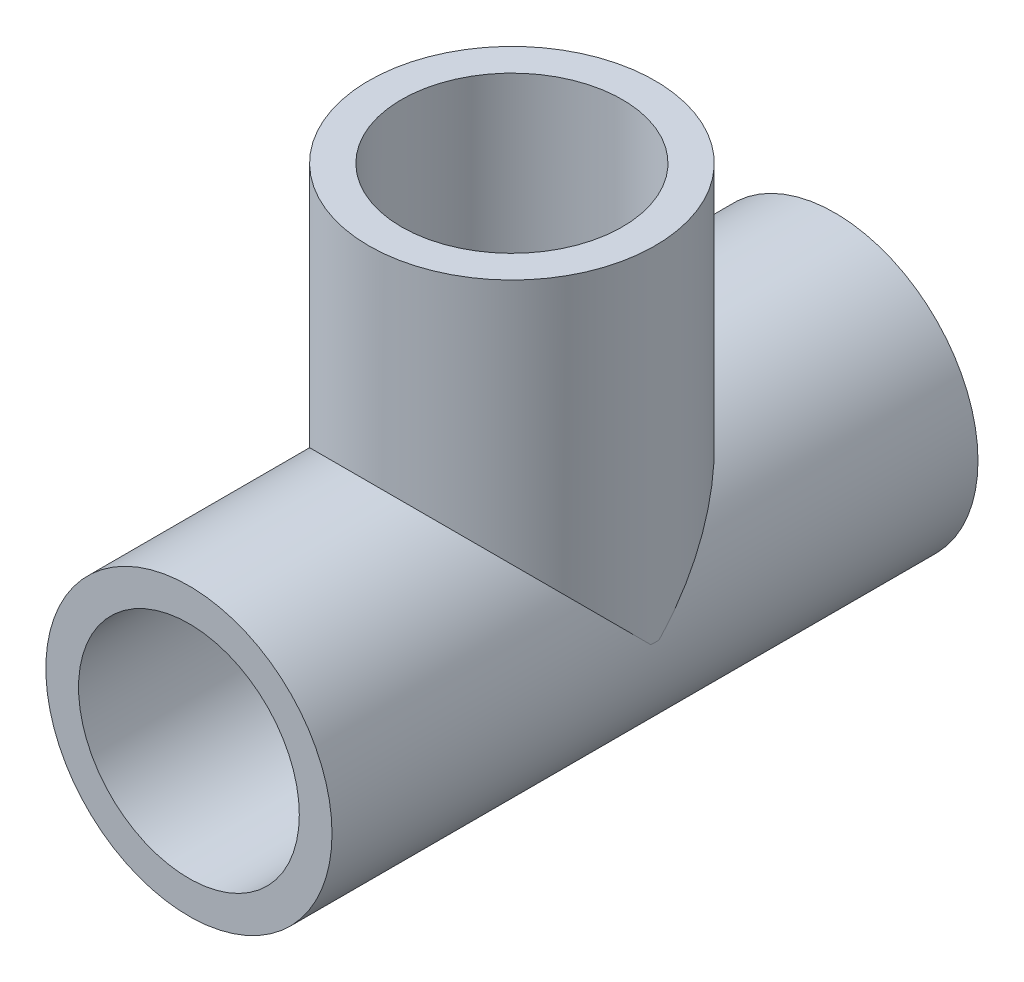
ISO-10303-21;
HEADER;
FILE_DESCRIPTION(('STEP AP214'),'2;1');
FILE_NAME('part.step','',(''),(''),'','','');
FILE_SCHEMA(('AUTOMOTIVE_DESIGN { 1 0 10303 214 1 1 1 1 }'));
ENDSEC;
DATA;
#1=APPLICATION_CONTEXT('core data for automotive mechanical design processes');
#2=APPLICATION_PROTOCOL_DEFINITION('international standard','automotive_design',2000,#1);
#3=PRODUCT_CONTEXT('',#1,'mechanical');
#4=PRODUCT('Part','Part','',(#3));
#5=PRODUCT_RELATED_PRODUCT_CATEGORY('part','',(#4));
#6=PRODUCT_DEFINITION_FORMATION('','',#4);
#7=PRODUCT_DEFINITION_CONTEXT('part definition',#1,'design');
#8=PRODUCT_DEFINITION('design','',#6,#7);
#9=PRODUCT_DEFINITION_SHAPE('','',#8);
#10=(LENGTH_UNIT() NAMED_UNIT(*) SI_UNIT(.MILLI.,.METRE.));
#11=(NAMED_UNIT(*) PLANE_ANGLE_UNIT() SI_UNIT($,.RADIAN.));
#12=(NAMED_UNIT(*) SI_UNIT($,.STERADIAN.) SOLID_ANGLE_UNIT());
#13=UNCERTAINTY_MEASURE_WITH_UNIT(LENGTH_MEASURE(1.E-05),#10,'distance_accuracy_value','');
#14=(GEOMETRIC_REPRESENTATION_CONTEXT(3) GLOBAL_UNCERTAINTY_ASSIGNED_CONTEXT((#13)) GLOBAL_UNIT_ASSIGNED_CONTEXT((#10,
#11,#12)) REPRESENTATION_CONTEXT('',''));
#15=CARTESIAN_POINT('',(0.,0.,0.));
#16=DIRECTION('',(0.,0.,1.));
#17=DIRECTION('',(1.,0.,0.));
#18=AXIS2_PLACEMENT_3D('',#15,#16,#17);
#19=CARTESIAN_POINT('',(0.,0.,0.));
#20=DIRECTION('',(0.,0.,-1.));
#21=DIRECTION('',(-1.,0.,0.));
#22=AXIS2_PLACEMENT_3D('',#19,#20,#21);
#23=CYLINDRICAL_SURFACE('',#22,17.5);
#24=CARTESIAN_POINT('',(0.,0.,0.));
#25=DIRECTION('',(0.,0.,1.));
#26=DIRECTION('',(1.,0.,0.));
#27=AXIS2_PLACEMENT_3D('',#24,#25,#26);
#28=CIRCLE('',#27,17.5);
#29=CARTESIAN_POINT('',(17.5,0.,0.));
#30=VERTEX_POINT('',#29);
#31=EDGE_CURVE('E36',#30,#30,#28,.T.);
#32=ORIENTED_EDGE('',*,*,#31,.F.);
#33=EDGE_LOOP('',(#32));
#34=FACE_BOUND('',#33,.T.);
#35=CARTESIAN_POINT('',(0.,0.,-79.));
#36=DIRECTION('',(0.,0.,1.));
#37=DIRECTION('',(1.,0.,0.));
#38=AXIS2_PLACEMENT_3D('',#35,#36,#37);
#39=CIRCLE('',#38,17.5);
#40=CARTESIAN_POINT('',(17.5,0.,-79.));
#41=VERTEX_POINT('',#40);
#42=EDGE_CURVE('E93',#41,#41,#39,.T.);
#43=ORIENTED_EDGE('',*,*,#42,.T.);
#44=EDGE_LOOP('',(#43));
#45=FACE_BOUND('',#44,.T.);
#46=DIRECTION('',(0.,0.,-1.));
#47=VECTOR('',#46,1.);
#48=CARTESIAN_POINT('',(17.4928556845359,0.500000000000004,0.));
#49=LINE('',#48,#47);
#50=CARTESIAN_POINT('',(17.4928556845359,0.500000000000004,-39.));
#51=VERTEX_POINT('',#50);
#52=CARTESIAN_POINT('',(17.4928556845359,0.500000000000004,-40.));
#53=VERTEX_POINT('',#52);
#54=EDGE_CURVE('E56',#51,#53,#49,.T.);
#55=ORIENTED_EDGE('',*,*,#54,.F.);
#56=CARTESIAN_POINT('',(0.,0.,-39.5));
#57=DIRECTION('',(0.,0.707106781186547,-0.707106781186547));
#58=DIRECTION('',(0.,-0.707106781186547,-0.707106781186547));
#59=AXIS2_PLACEMENT_3D('',#56,#57,#58);
#60=ELLIPSE('',#59,24.7487373415292,17.5);
#61=CARTESIAN_POINT('',(-17.4928556845359,0.500000000000004,-39.0000000000001));
#62=VERTEX_POINT('',#61);
#63=EDGE_CURVE('E90',#51,#62,#60,.F.);
#64=ORIENTED_EDGE('',*,*,#63,.T.);
#65=DIRECTION('',(0.,0.,-1.));
#66=VECTOR('',#65,1.);
#67=CARTESIAN_POINT('',(-17.4928556845359,0.500000000000004,0.));
#68=LINE('',#67,#66);
#69=CARTESIAN_POINT('',(-17.4928556845359,0.500000000000004,-39.9999999999999));
#70=VERTEX_POINT('',#69);
#71=EDGE_CURVE('E84',#70,#62,#68,.F.);
#72=ORIENTED_EDGE('',*,*,#71,.F.);
#73=CARTESIAN_POINT('',(0.,0.,-39.5));
#74=DIRECTION('',(0.,-0.707106781186547,-0.707106781186547));
#75=DIRECTION('',(0.,0.707106781186547,-0.707106781186547));
#76=AXIS2_PLACEMENT_3D('',#73,#74,#75);
#77=ELLIPSE('',#76,24.7487373415292,17.5);
#78=EDGE_CURVE('E88',#70,#53,#77,.T.);
#79=ORIENTED_EDGE('',*,*,#78,.T.);
#80=EDGE_LOOP('',(#55,#64,#72,#79));
#81=FACE_BOUND('',#80,.T.);
#82=ADVANCED_FACE('F33',(#34,#45,#81),#23,.T.);
#83=CARTESIAN_POINT('',(0.,0.,0.));
#84=DIRECTION('',(0.,0.,-1.));
#85=DIRECTION('',(-1.,0.,0.));
#86=AXIS2_PLACEMENT_3D('',#83,#84,#85);
#87=CYLINDRICAL_SURFACE('',#86,13.5);
#88=CARTESIAN_POINT('',(0.,0.,-39.5));
#89=DIRECTION('',(0.,0.707106781186547,0.707106781186547));
#90=DIRECTION('',(0.,0.707106781186547,-0.707106781186547));
#91=AXIS2_PLACEMENT_3D('',#88,#89,#90);
#92=ELLIPSE('',#91,19.0918830920368,13.5);
#93=CARTESIAN_POINT('',(-13.5,0.,-39.5));
#94=VERTEX_POINT('',#93);
#95=CARTESIAN_POINT('',(13.5,0.,-39.5));
#96=VERTEX_POINT('',#95);
#97=EDGE_CURVE('E66',#94,#96,#92,.F.);
#98=ORIENTED_EDGE('',*,*,#97,.F.);
#99=CARTESIAN_POINT('',(0.,0.,-39.5));
#100=DIRECTION('',(0.,0.707106781186547,-0.707106781186547));
#101=DIRECTION('',(0.,0.707106781186547,0.707106781186547));
#102=AXIS2_PLACEMENT_3D('',#99,#100,#101);
#103=ELLIPSE('',#102,19.0918830920368,13.5);
#104=EDGE_CURVE('E48',#96,#94,#103,.F.);
#105=ORIENTED_EDGE('',*,*,#104,.F.);
#106=EDGE_LOOP('',(#98,#105));
#107=FACE_BOUND('',#106,.T.);
#108=CARTESIAN_POINT('',(0.,0.,0.));
#109=DIRECTION('',(0.,0.,1.));
#110=DIRECTION('',(1.,0.,0.));
#111=AXIS2_PLACEMENT_3D('',#108,#109,#110);
#112=CIRCLE('',#111,13.5);
#113=CARTESIAN_POINT('',(13.5,0.,0.));
#114=VERTEX_POINT('',#113);
#115=EDGE_CURVE('E41',#114,#114,#112,.F.);
#116=ORIENTED_EDGE('',*,*,#115,.F.);
#117=EDGE_LOOP('',(#116));
#118=FACE_BOUND('',#117,.T.);
#119=CARTESIAN_POINT('',(0.,0.,-79.));
#120=DIRECTION('',(0.,0.,1.));
#121=DIRECTION('',(1.,0.,0.));
#122=AXIS2_PLACEMENT_3D('',#119,#120,#121);
#123=CIRCLE('',#122,13.5);
#124=CARTESIAN_POINT('',(13.5,0.,-79.));
#125=VERTEX_POINT('',#124);
#126=EDGE_CURVE('E11',#125,#125,#123,.F.);
#127=ORIENTED_EDGE('',*,*,#126,.T.);
#128=EDGE_LOOP('',(#127));
#129=FACE_BOUND('',#128,.T.);
#130=ADVANCED_FACE('F70',(#107,#118,#129),#87,.F.);
#131=CARTESIAN_POINT('',(0.,0.,0.));
#132=DIRECTION('',(0.,0.,1.));
#133=DIRECTION('',(1.,0.,0.));
#134=AXIS2_PLACEMENT_3D('',#131,#132,#133);
#135=PLANE('',#134);
#136=ORIENTED_EDGE('',*,*,#115,.T.);
#137=EDGE_LOOP('',(#136));
#138=FACE_BOUND('',#137,.T.);
#139=ORIENTED_EDGE('',*,*,#31,.T.);
#140=EDGE_LOOP('',(#139));
#141=FACE_BOUND('',#140,.T.);
#142=ADVANCED_FACE('F100',(#138,#141),#135,.T.);
#143=CARTESIAN_POINT('',(0.,0.,-79.));
#144=DIRECTION('',(0.,0.,1.));
#145=DIRECTION('',(1.,0.,0.));
#146=AXIS2_PLACEMENT_3D('',#143,#144,#145);
#147=PLANE('',#146);
#148=ORIENTED_EDGE('',*,*,#126,.F.);
#149=EDGE_LOOP('',(#148));
#150=FACE_BOUND('',#149,.T.);
#151=ORIENTED_EDGE('',*,*,#42,.F.);
#152=EDGE_LOOP('',(#151));
#153=FACE_BOUND('',#152,.T.);
#154=ADVANCED_FACE('F107',(#150,#153),#147,.F.);
#155=CARTESIAN_POINT('',(0.,0.500000000000004,-39.5));
#156=DIRECTION('',(0.,1.,0.));
#157=DIRECTION('',(0.,0.,1.));
#158=AXIS2_PLACEMENT_3D('',#155,#156,#157);
#159=CYLINDRICAL_SURFACE('',#158,17.5);
#160=CARTESIAN_POINT('',(0.,42.5,-39.5));
#161=DIRECTION('',(0.,1.,0.));
#162=DIRECTION('',(0.,0.,1.));
#163=AXIS2_PLACEMENT_3D('',#160,#161,#162);
#164=CIRCLE('',#163,17.5);
#165=CARTESIAN_POINT('',(0.,42.5,-22.));
#166=VERTEX_POINT('',#165);
#167=EDGE_CURVE('E75',#166,#166,#164,.T.);
#168=ORIENTED_EDGE('',*,*,#167,.F.);
#169=EDGE_LOOP('',(#168));
#170=FACE_BOUND('',#169,.T.);
#171=ORIENTED_EDGE('',*,*,#63,.F.);
#172=CARTESIAN_POINT('',(0.,0.500000000000004,-39.5));
#173=DIRECTION('',(0.,1.,0.));
#174=DIRECTION('',(0.,0.,1.));
#175=AXIS2_PLACEMENT_3D('',#172,#173,#174);
#176=CIRCLE('',#175,17.5);
#177=EDGE_CURVE('E83',#51,#53,#176,.T.);
#178=ORIENTED_EDGE('',*,*,#177,.T.);
#179=ORIENTED_EDGE('',*,*,#78,.F.);
#180=EDGE_CURVE('E80',#70,#62,#176,.T.);
#181=ORIENTED_EDGE('',*,*,#180,.T.);
#182=EDGE_LOOP('',(#171,#178,#179,#181));
#183=FACE_BOUND('',#182,.T.);
#184=ADVANCED_FACE('F112',(#170,#183),#159,.T.);
#185=CARTESIAN_POINT('',(0.,0.500000000000004,-39.5));
#186=DIRECTION('',(0.,1.,0.));
#187=DIRECTION('',(0.,0.,1.));
#188=AXIS2_PLACEMENT_3D('',#185,#186,#187);
#189=PLANE('',#188);
#190=ORIENTED_EDGE('',*,*,#177,.F.);
#191=ORIENTED_EDGE('',*,*,#54,.T.);
#192=EDGE_LOOP('',(#190,#191));
#193=FACE_BOUND('',#192,.T.);
#194=ADVANCED_FACE('F120',(#193),#189,.F.);
#195=ORIENTED_EDGE('',*,*,#180,.F.);
#196=ORIENTED_EDGE('',*,*,#71,.T.);
#197=EDGE_LOOP('',(#195,#196));
#198=FACE_BOUND('',#197,.T.);
#199=ADVANCED_FACE('F128',(#198),#189,.F.);
#200=CARTESIAN_POINT('',(0.,42.5,-39.5));
#201=DIRECTION('',(0.,1.,0.));
#202=DIRECTION('',(0.,0.,1.));
#203=AXIS2_PLACEMENT_3D('',#200,#201,#202);
#204=PLANE('',#203);
#205=CARTESIAN_POINT('',(0.,42.5,-39.5));
#206=DIRECTION('',(0.,1.,0.));
#207=DIRECTION('',(0.,0.,1.));
#208=AXIS2_PLACEMENT_3D('',#205,#206,#207);
#209=CIRCLE('',#208,13.5);
#210=CARTESIAN_POINT('',(0.,42.5,-26.));
#211=VERTEX_POINT('',#210);
#212=EDGE_CURVE('E72',#211,#211,#209,.T.);
#213=ORIENTED_EDGE('',*,*,#212,.F.);
#214=EDGE_LOOP('',(#213));
#215=FACE_BOUND('',#214,.T.);
#216=ORIENTED_EDGE('',*,*,#167,.T.);
#217=EDGE_LOOP('',(#216));
#218=FACE_BOUND('',#217,.T.);
#219=ADVANCED_FACE('F134',(#215,#218),#204,.T.);
#220=CARTESIAN_POINT('',(0.,-17.501,-39.5));
#221=DIRECTION('',(0.,1.,0.));
#222=DIRECTION('',(0.,0.,1.));
#223=AXIS2_PLACEMENT_3D('',#220,#221,#222);
#224=CYLINDRICAL_SURFACE('',#223,13.5);
#225=ORIENTED_EDGE('',*,*,#212,.T.);
#226=EDGE_LOOP('',(#225));
#227=FACE_BOUND('',#226,.T.);
#228=ORIENTED_EDGE('',*,*,#104,.T.);
#229=ORIENTED_EDGE('',*,*,#97,.T.);
#230=EDGE_LOOP('',(#228,#229));
#231=FACE_BOUND('',#230,.T.);
#232=ADVANCED_FACE('F67',(#227,#231),#224,.F.);
#233=CLOSED_SHELL('',(#82,#130,#142,#154,#184,#194,#199,#219,#232));
#234=MANIFOLD_SOLID_BREP('B2',#233);
#235=ADVANCED_BREP_SHAPE_REPRESENTATION('',(#18,#234),#14);
#236=SHAPE_DEFINITION_REPRESENTATION(#9,#235);
ENDSEC;
END-ISO-10303-21;
